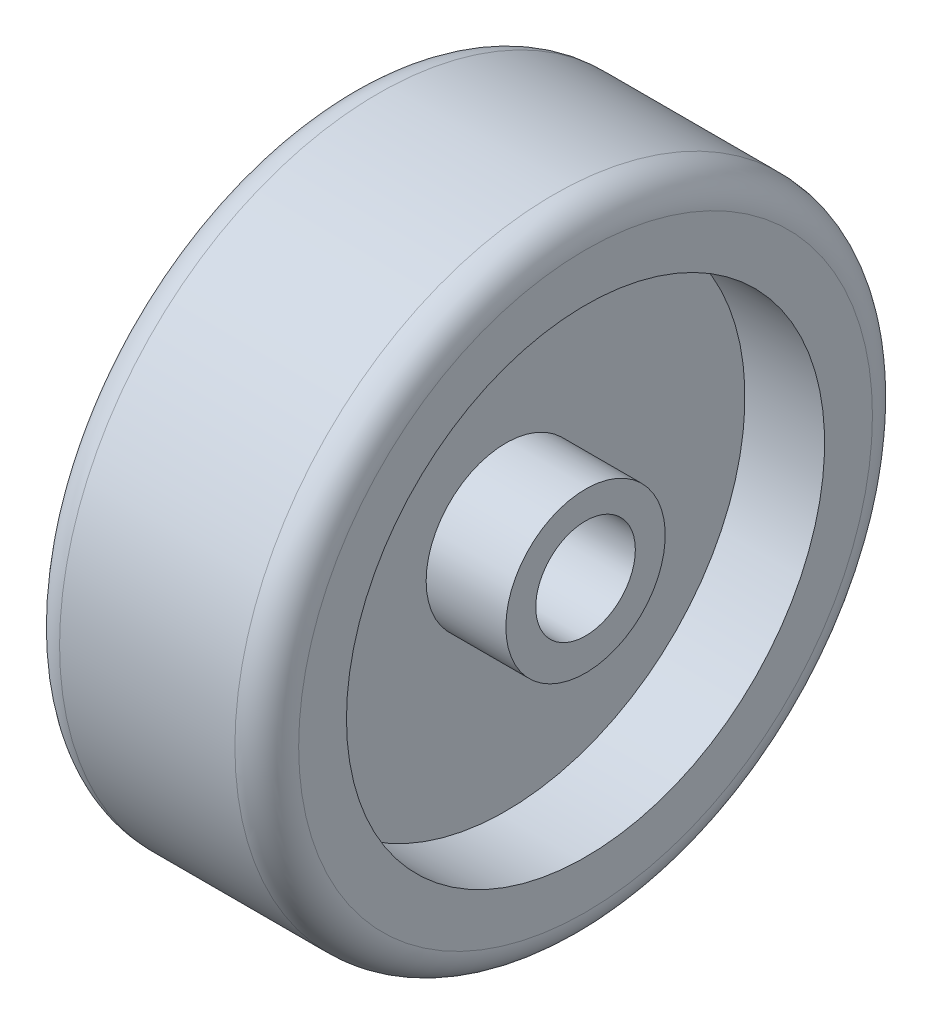
ISO-10303-21;
HEADER;
FILE_DESCRIPTION(('STEP AP214'),'2;1');
FILE_NAME('part.step','',(''),(''),'','','');
FILE_SCHEMA(('AUTOMOTIVE_DESIGN { 1 0 10303 214 1 1 1 1 }'));
ENDSEC;
DATA;
#1=APPLICATION_CONTEXT('core data for automotive mechanical design processes');
#2=APPLICATION_PROTOCOL_DEFINITION('international standard','automotive_design',2000,#1);
#3=PRODUCT_CONTEXT('',#1,'mechanical');
#4=PRODUCT('Part','Part','',(#3));
#5=PRODUCT_RELATED_PRODUCT_CATEGORY('part','',(#4));
#6=PRODUCT_DEFINITION_FORMATION('','',#4);
#7=PRODUCT_DEFINITION_CONTEXT('part definition',#1,'design');
#8=PRODUCT_DEFINITION('design','',#6,#7);
#9=PRODUCT_DEFINITION_SHAPE('','',#8);
#10=(LENGTH_UNIT() NAMED_UNIT(*) SI_UNIT(.MILLI.,.METRE.));
#11=(NAMED_UNIT(*) PLANE_ANGLE_UNIT() SI_UNIT($,.RADIAN.));
#12=(NAMED_UNIT(*) SI_UNIT($,.STERADIAN.) SOLID_ANGLE_UNIT());
#13=UNCERTAINTY_MEASURE_WITH_UNIT(LENGTH_MEASURE(1.E-05),#10,'distance_accuracy_value','');
#14=(GEOMETRIC_REPRESENTATION_CONTEXT(3) GLOBAL_UNCERTAINTY_ASSIGNED_CONTEXT((#13)) GLOBAL_UNIT_ASSIGNED_CONTEXT((#10,
#11,#12)) REPRESENTATION_CONTEXT('',''));
#15=CARTESIAN_POINT('',(0.,0.,0.));
#16=DIRECTION('',(0.,0.,1.));
#17=DIRECTION('',(1.,0.,0.));
#18=AXIS2_PLACEMENT_3D('',#15,#16,#17);
#19=CARTESIAN_POINT('',(38.1,-0.729526652101731,0.));
#20=DIRECTION('',(-1.,0.,0.));
#21=DIRECTION('',(0.,0.,1.));
#22=AXIS2_PLACEMENT_3D('',#19,#20,#21);
#23=PLANE('',#22);
#24=CARTESIAN_POINT('',(38.1,0.,0.));
#25=DIRECTION('',(1.,0.,0.));
#26=DIRECTION('',(0.,0.,-1.));
#27=AXIS2_PLACEMENT_3D('',#24,#25,#26);
#28=CIRCLE('',#27,15.875);
#29=CARTESIAN_POINT('',(38.1,0.,-15.875));
#30=VERTEX_POINT('',#29);
#31=EDGE_CURVE('E113',#30,#30,#28,.T.);
#32=ORIENTED_EDGE('',*,*,#31,.F.);
#33=EDGE_LOOP('',(#32));
#34=FACE_BOUND('',#33,.T.);
#35=CARTESIAN_POINT('',(38.1,-0.729526652101731,0.));
#36=DIRECTION('',(-1.,0.,0.));
#37=DIRECTION('',(0.,0.,1.));
#38=AXIS2_PLACEMENT_3D('',#35,#36,#37);
#39=CIRCLE('',#38,25.4);
#40=CARTESIAN_POINT('',(38.1,-0.729526652101731,25.4));
#41=VERTEX_POINT('',#40);
#42=EDGE_CURVE('E80',#41,#41,#39,.T.);
#43=ORIENTED_EDGE('',*,*,#42,.F.);
#44=EDGE_LOOP('',(#43));
#45=FACE_BOUND('',#44,.T.);
#46=ADVANCED_FACE('F56',(#34,#45),#23,.F.);
#47=CARTESIAN_POINT('',(-38.1,-0.729526652101731,0.));
#48=DIRECTION('',(-1.,0.,0.));
#49=DIRECTION('',(0.,0.,1.));
#50=AXIS2_PLACEMENT_3D('',#47,#48,#49);
#51=CYLINDRICAL_SURFACE('',#50,25.4);
#52=CARTESIAN_POINT('',(12.7,-0.729526652101731,0.));
#53=DIRECTION('',(-1.,0.,0.));
#54=DIRECTION('',(0.,0.,1.));
#55=AXIS2_PLACEMENT_3D('',#52,#53,#54);
#56=CIRCLE('',#55,25.4);
#57=CARTESIAN_POINT('',(12.7,-0.729526652101731,25.4));
#58=VERTEX_POINT('',#57);
#59=EDGE_CURVE('E84',#58,#58,#56,.T.);
#60=ORIENTED_EDGE('',*,*,#59,.F.);
#61=EDGE_LOOP('',(#60));
#62=FACE_BOUND('',#61,.T.);
#63=ORIENTED_EDGE('',*,*,#42,.T.);
#64=EDGE_LOOP('',(#63));
#65=FACE_BOUND('',#64,.T.);
#66=ADVANCED_FACE('F133',(#62,#65),#51,.T.);
#67=CARTESIAN_POINT('',(12.7,24.6704733478983,0.));
#68=DIRECTION('',(-1.,0.,0.));
#69=DIRECTION('',(0.,0.,1.));
#70=AXIS2_PLACEMENT_3D('',#67,#68,#69);
#71=PLANE('',#70);
#72=CARTESIAN_POINT('',(12.7,-0.729526652101731,0.));
#73=DIRECTION('',(-1.,0.,0.));
#74=DIRECTION('',(0.,0.,1.));
#75=AXIS2_PLACEMENT_3D('',#72,#73,#74);
#76=CIRCLE('',#75,76.2);
#77=CARTESIAN_POINT('',(12.7,-0.729526652101731,76.2));
#78=VERTEX_POINT('',#77);
#79=EDGE_CURVE('E88',#78,#78,#76,.T.);
#80=ORIENTED_EDGE('',*,*,#79,.F.);
#81=EDGE_LOOP('',(#80));
#82=FACE_BOUND('',#81,.T.);
#83=ORIENTED_EDGE('',*,*,#59,.T.);
#84=EDGE_LOOP('',(#83));
#85=FACE_BOUND('',#84,.T.);
#86=ADVANCED_FACE('F138',(#82,#85),#71,.F.);
#87=CARTESIAN_POINT('',(-38.1,-0.729526652101731,0.));
#88=DIRECTION('',(-1.,0.,0.));
#89=DIRECTION('',(0.,0.,1.));
#90=AXIS2_PLACEMENT_3D('',#87,#88,#89);
#91=CYLINDRICAL_SURFACE('',#90,76.2);
#92=CARTESIAN_POINT('',(38.1,-0.729526652101731,0.));
#93=DIRECTION('',(-1.,0.,0.));
#94=DIRECTION('',(0.,0.,1.));
#95=AXIS2_PLACEMENT_3D('',#92,#93,#94);
#96=CIRCLE('',#95,76.2);
#97=CARTESIAN_POINT('',(38.1,-0.729526652101731,76.2));
#98=VERTEX_POINT('',#97);
#99=EDGE_CURVE('E92',#98,#98,#96,.T.);
#100=ORIENTED_EDGE('',*,*,#99,.F.);
#101=EDGE_LOOP('',(#100));
#102=FACE_BOUND('',#101,.T.);
#103=ORIENTED_EDGE('',*,*,#79,.T.);
#104=EDGE_LOOP('',(#103));
#105=FACE_BOUND('',#104,.T.);
#106=ADVANCED_FACE('F144',(#102,#105),#91,.F.);
#107=CARTESIAN_POINT('',(38.1,75.4704733478983,0.));
#108=DIRECTION('',(-1.,0.,0.));
#109=DIRECTION('',(0.,0.,1.));
#110=AXIS2_PLACEMENT_3D('',#107,#108,#109);
#111=PLANE('',#110);
#112=CARTESIAN_POINT('',(38.1,-0.729526652101731,0.));
#113=DIRECTION('',(-1.,0.,0.));
#114=DIRECTION('',(0.,0.,1.));
#115=AXIS2_PLACEMENT_3D('',#112,#113,#114);
#116=CIRCLE('',#115,91.44);
#117=CARTESIAN_POINT('',(38.1,-0.729526652101731,91.44));
#118=VERTEX_POINT('',#117);
#119=EDGE_CURVE('E69',#118,#118,#116,.F.);
#120=ORIENTED_EDGE('',*,*,#119,.T.);
#121=EDGE_LOOP('',(#120));
#122=FACE_BOUND('',#121,.T.);
#123=ORIENTED_EDGE('',*,*,#99,.T.);
#124=EDGE_LOOP('',(#123));
#125=FACE_BOUND('',#124,.T.);
#126=ADVANCED_FACE('F162',(#122,#125),#111,.F.);
#127=CARTESIAN_POINT('',(-38.1,-0.729526652101731,0.));
#128=DIRECTION('',(-1.,0.,0.));
#129=DIRECTION('',(0.,0.,1.));
#130=AXIS2_PLACEMENT_3D('',#127,#128,#129);
#131=CYLINDRICAL_SURFACE('',#130,101.6);
#132=CARTESIAN_POINT('',(-27.94,-0.729526652101731,0.));
#133=DIRECTION('',(1.,0.,0.));
#134=DIRECTION('',(0.,0.,-1.));
#135=AXIS2_PLACEMENT_3D('',#132,#133,#134);
#136=CIRCLE('',#135,101.6);
#137=CARTESIAN_POINT('',(-27.94,-0.729526652101731,-101.6));
#138=VERTEX_POINT('',#137);
#139=EDGE_CURVE('E11',#138,#138,#136,.T.);
#140=ORIENTED_EDGE('',*,*,#139,.T.);
#141=EDGE_LOOP('',(#140));
#142=FACE_BOUND('',#141,.T.);
#143=CARTESIAN_POINT('',(27.94,-0.729526652101731,0.));
#144=DIRECTION('',(-1.,0.,0.));
#145=DIRECTION('',(0.,0.,1.));
#146=AXIS2_PLACEMENT_3D('',#143,#144,#145);
#147=CIRCLE('',#146,101.6);
#148=CARTESIAN_POINT('',(27.94,-0.729526652101731,101.6));
#149=VERTEX_POINT('',#148);
#150=EDGE_CURVE('E74',#149,#149,#147,.T.);
#151=ORIENTED_EDGE('',*,*,#150,.T.);
#152=EDGE_LOOP('',(#151));
#153=FACE_BOUND('',#152,.T.);
#154=ADVANCED_FACE('F159',(#142,#153),#131,.T.);
#155=CARTESIAN_POINT('',(-38.1,75.4704733478983,0.));
#156=DIRECTION('',(1.,0.,0.));
#157=DIRECTION('',(0.,0.,-1.));
#158=AXIS2_PLACEMENT_3D('',#155,#156,#157);
#159=PLANE('',#158);
#160=CARTESIAN_POINT('',(-38.1,-0.729526652101731,0.));
#161=DIRECTION('',(1.,0.,0.));
#162=DIRECTION('',(0.,0.,-1.));
#163=AXIS2_PLACEMENT_3D('',#160,#161,#162);
#164=CIRCLE('',#163,91.44);
#165=CARTESIAN_POINT('',(-38.1,-0.729526652101731,-91.44));
#166=VERTEX_POINT('',#165);
#167=EDGE_CURVE('E64',#166,#166,#164,.F.);
#168=ORIENTED_EDGE('',*,*,#167,.T.);
#169=EDGE_LOOP('',(#168));
#170=FACE_BOUND('',#169,.T.);
#171=CARTESIAN_POINT('',(-38.1,-0.729526652101731,0.));
#172=DIRECTION('',(-1.,0.,0.));
#173=DIRECTION('',(0.,0.,1.));
#174=AXIS2_PLACEMENT_3D('',#171,#172,#173);
#175=CIRCLE('',#174,76.2);
#176=CARTESIAN_POINT('',(-38.1,-0.729526652101731,76.2));
#177=VERTEX_POINT('',#176);
#178=EDGE_CURVE('E96',#177,#177,#175,.T.);
#179=ORIENTED_EDGE('',*,*,#178,.F.);
#180=EDGE_LOOP('',(#179));
#181=FACE_BOUND('',#180,.T.);
#182=ADVANCED_FACE('F161',(#170,#181),#159,.F.);
#183=CARTESIAN_POINT('',(-38.1,-0.729526652101731,0.));
#184=DIRECTION('',(-1.,0.,0.));
#185=DIRECTION('',(0.,0.,1.));
#186=AXIS2_PLACEMENT_3D('',#183,#184,#185);
#187=CYLINDRICAL_SURFACE('',#186,76.2);
#188=CARTESIAN_POINT('',(-12.7,-0.729526652101731,0.));
#189=DIRECTION('',(-1.,0.,0.));
#190=DIRECTION('',(0.,0.,1.));
#191=AXIS2_PLACEMENT_3D('',#188,#189,#190);
#192=CIRCLE('',#191,76.2);
#193=CARTESIAN_POINT('',(-12.7,-0.729526652101731,76.2));
#194=VERTEX_POINT('',#193);
#195=EDGE_CURVE('E100',#194,#194,#192,.T.);
#196=ORIENTED_EDGE('',*,*,#195,.F.);
#197=EDGE_LOOP('',(#196));
#198=FACE_BOUND('',#197,.T.);
#199=ORIENTED_EDGE('',*,*,#178,.T.);
#200=EDGE_LOOP('',(#199));
#201=FACE_BOUND('',#200,.T.);
#202=ADVANCED_FACE('F168',(#198,#201),#187,.F.);
#203=CARTESIAN_POINT('',(-12.7,24.6704733478983,0.));
#204=DIRECTION('',(1.,0.,0.));
#205=DIRECTION('',(0.,0.,-1.));
#206=AXIS2_PLACEMENT_3D('',#203,#204,#205);
#207=PLANE('',#206);
#208=CARTESIAN_POINT('',(-12.7,-0.729526652101731,0.));
#209=DIRECTION('',(-1.,0.,0.));
#210=DIRECTION('',(0.,0.,1.));
#211=AXIS2_PLACEMENT_3D('',#208,#209,#210);
#212=CIRCLE('',#211,25.4);
#213=CARTESIAN_POINT('',(-12.7,-0.729526652101731,25.4));
#214=VERTEX_POINT('',#213);
#215=EDGE_CURVE('E104',#214,#214,#212,.T.);
#216=ORIENTED_EDGE('',*,*,#215,.F.);
#217=EDGE_LOOP('',(#216));
#218=FACE_BOUND('',#217,.T.);
#219=ORIENTED_EDGE('',*,*,#195,.T.);
#220=EDGE_LOOP('',(#219));
#221=FACE_BOUND('',#220,.T.);
#222=ADVANCED_FACE('F221',(#218,#221),#207,.F.);
#223=CARTESIAN_POINT('',(-38.1,-0.729526652101731,0.));
#224=DIRECTION('',(-1.,0.,0.));
#225=DIRECTION('',(0.,0.,1.));
#226=AXIS2_PLACEMENT_3D('',#223,#224,#225);
#227=CYLINDRICAL_SURFACE('',#226,25.4);
#228=CARTESIAN_POINT('',(-38.1,-0.729526652101731,0.));
#229=DIRECTION('',(-1.,0.,0.));
#230=DIRECTION('',(0.,0.,1.));
#231=AXIS2_PLACEMENT_3D('',#228,#229,#230);
#232=CIRCLE('',#231,25.4);
#233=CARTESIAN_POINT('',(-38.1,-0.729526652101731,25.4));
#234=VERTEX_POINT('',#233);
#235=EDGE_CURVE('E108',#234,#234,#232,.T.);
#236=ORIENTED_EDGE('',*,*,#235,.F.);
#237=EDGE_LOOP('',(#236));
#238=FACE_BOUND('',#237,.T.);
#239=ORIENTED_EDGE('',*,*,#215,.T.);
#240=EDGE_LOOP('',(#239));
#241=FACE_BOUND('',#240,.T.);
#242=ADVANCED_FACE('F227',(#238,#241),#227,.T.);
#243=CARTESIAN_POINT('',(-38.1,-0.729526652101731,0.));
#244=DIRECTION('',(1.,0.,0.));
#245=DIRECTION('',(0.,0.,-1.));
#246=AXIS2_PLACEMENT_3D('',#243,#244,#245);
#247=PLANE('',#246);
#248=CARTESIAN_POINT('',(-38.1,0.,0.));
#249=DIRECTION('',(1.,0.,0.));
#250=DIRECTION('',(0.,0.,-1.));
#251=AXIS2_PLACEMENT_3D('',#248,#249,#250);
#252=CIRCLE('',#251,15.875);
#253=CARTESIAN_POINT('',(-38.1,0.,-15.875));
#254=VERTEX_POINT('',#253);
#255=EDGE_CURVE('E112',#254,#254,#252,.T.);
#256=ORIENTED_EDGE('',*,*,#255,.T.);
#257=EDGE_LOOP('',(#256));
#258=FACE_BOUND('',#257,.T.);
#259=ORIENTED_EDGE('',*,*,#235,.T.);
#260=EDGE_LOOP('',(#259));
#261=FACE_BOUND('',#260,.T.);
#262=ADVANCED_FACE('F121',(#258,#261),#247,.F.);
#263=CARTESIAN_POINT('',(-38.1,0.,0.));
#264=DIRECTION('',(1.,0.,0.));
#265=DIRECTION('',(0.,0.,-1.));
#266=AXIS2_PLACEMENT_3D('',#263,#264,#265);
#267=CYLINDRICAL_SURFACE('',#266,15.875);
#268=CARTESIAN_POINT('',(-38.1,0.,-15.875));
#269=CARTESIAN_POINT('',(-37.30625,0.,-15.875));
#270=CARTESIAN_POINT('',(-36.5125,0.,-15.875));
#271=CARTESIAN_POINT('',(-34.925,0.,-15.875));
#272=CARTESIAN_POINT('',(-34.13125,0.,-15.875));
#273=CARTESIAN_POINT('',(-32.54375,0.,-15.875));
#274=CARTESIAN_POINT('',(-31.75,0.,-15.875));
#275=CARTESIAN_POINT('',(-30.1625,0.,-15.875));
#276=CARTESIAN_POINT('',(-29.36875,0.,-15.875));
#277=CARTESIAN_POINT('',(-27.78125,0.,-15.875));
#278=CARTESIAN_POINT('',(-26.9875,0.,-15.875));
#279=CARTESIAN_POINT('',(-25.4,0.,-15.875));
#280=CARTESIAN_POINT('',(-24.60625,0.,-15.875));
#281=CARTESIAN_POINT('',(-23.01875,0.,-15.875));
#282=CARTESIAN_POINT('',(-22.225,0.,-15.875));
#283=CARTESIAN_POINT('',(-20.6375,0.,-15.875));
#284=CARTESIAN_POINT('',(-19.84375,0.,-15.875));
#285=CARTESIAN_POINT('',(-18.25625,0.,-15.875));
#286=CARTESIAN_POINT('',(-17.4625,0.,-15.875));
#287=CARTESIAN_POINT('',(-15.875,0.,-15.875));
#288=CARTESIAN_POINT('',(-15.08125,0.,-15.875));
#289=CARTESIAN_POINT('',(-13.49375,0.,-15.875));
#290=CARTESIAN_POINT('',(-12.7,0.,-15.875));
#291=CARTESIAN_POINT('',(-11.1125,0.,-15.875));
#292=CARTESIAN_POINT('',(-10.31875,0.,-15.875));
#293=CARTESIAN_POINT('',(-8.73125,0.,-15.875));
#294=CARTESIAN_POINT('',(-7.9375,0.,-15.875));
#295=CARTESIAN_POINT('',(-6.35,0.,-15.875));
#296=CARTESIAN_POINT('',(-5.55625,0.,-15.875));
#297=CARTESIAN_POINT('',(-3.96875,0.,-15.875));
#298=CARTESIAN_POINT('',(-3.175,0.,-15.875));
#299=CARTESIAN_POINT('',(-1.5875,0.,-15.875));
#300=CARTESIAN_POINT('',(-0.793750000000001,0.,-15.875));
#301=CARTESIAN_POINT('',(0.793750000000001,0.,-15.875));
#302=CARTESIAN_POINT('',(1.5875,0.,-15.875));
#303=CARTESIAN_POINT('',(3.175,0.,-15.875));
#304=CARTESIAN_POINT('',(3.96875,0.,-15.875));
#305=CARTESIAN_POINT('',(5.55625,0.,-15.875));
#306=CARTESIAN_POINT('',(6.35,0.,-15.875));
#307=CARTESIAN_POINT('',(7.93750000000001,0.,-15.875));
#308=CARTESIAN_POINT('',(8.73125,0.,-15.875));
#309=CARTESIAN_POINT('',(10.31875,0.,-15.875));
#310=CARTESIAN_POINT('',(11.1125,0.,-15.875));
#311=CARTESIAN_POINT('',(12.7,0.,-15.875));
#312=CARTESIAN_POINT('',(13.49375,0.,-15.875));
#313=CARTESIAN_POINT('',(15.08125,0.,-15.875));
#314=CARTESIAN_POINT('',(15.875,0.,-15.875));
#315=CARTESIAN_POINT('',(17.4625,0.,-15.875));
#316=CARTESIAN_POINT('',(18.25625,0.,-15.875));
#317=CARTESIAN_POINT('',(19.84375,0.,-15.875));
#318=CARTESIAN_POINT('',(20.6375,0.,-15.875));
#319=CARTESIAN_POINT('',(22.225,0.,-15.875));
#320=CARTESIAN_POINT('',(23.01875,0.,-15.875));
#321=CARTESIAN_POINT('',(24.60625,0.,-15.875));
#322=CARTESIAN_POINT('',(25.4,0.,-15.875));
#323=CARTESIAN_POINT('',(26.9875,0.,-15.875));
#324=CARTESIAN_POINT('',(27.78125,0.,-15.875));
#325=CARTESIAN_POINT('',(29.36875,0.,-15.875));
#326=CARTESIAN_POINT('',(30.1625,0.,-15.875));
#327=CARTESIAN_POINT('',(31.75,0.,-15.875));
#328=CARTESIAN_POINT('',(32.54375,0.,-15.875));
#329=CARTESIAN_POINT('',(34.13125,0.,-15.875));
#330=CARTESIAN_POINT('',(34.925,0.,-15.875));
#331=CARTESIAN_POINT('',(36.5125,0.,-15.875));
#332=CARTESIAN_POINT('',(37.30625,0.,-15.875));
#333=CARTESIAN_POINT('',(38.1,0.,-15.875));
#334=B_SPLINE_CURVE_WITH_KNOTS('',3,(#268,#269,#270,#271,#272,#273,#274,#275,#276,#277,#278,
#279,#280,#281,#282,#283,#284,#285,#286,#287,#288,#289,#290,#291,#292,#293,#294,#295,#296,#297,
#298,#299,#300,#301,#302,#303,#304,#305,#306,#307,#308,#309,#310,#311,#312,#313,#314,#315,#316,
#317,#318,#319,#320,#321,#322,#323,#324,#325,#326,#327,#328,#329,#330,#331,#332,#333),
.UNSPECIFIED.,.F.,.F.,(4,2,2,2,2,2,2,2,2,2,2,2,2,2,2,2,2,2,2,2,2,2,2,2,2,2,2,2,2,2,2,2,4),(0.,
2.38124999999999,4.7625,7.14375,9.525,11.90625,14.2875,16.66875,19.05,21.43125,23.8125,26.19375,
28.575,30.95625,33.3375,35.71875,38.1,40.48125,42.8625,45.24375,47.625,50.00625,52.3875,
54.76875,57.15,59.53125,61.9125,64.29375,66.675,69.05625,71.4375,73.81875,76.2),.UNSPECIFIED.);
#335=EDGE_CURVE('BSEAM124',#254,#30,#334,.T.);
#336=ORIENTED_EDGE('',*,*,#255,.F.);
#337=ORIENTED_EDGE('',*,*,#31,.T.);
#338=ORIENTED_EDGE('',*,*,#335,.T.);
#339=ORIENTED_EDGE('',*,*,#335,.F.);
#340=EDGE_LOOP('',(#336,#338,#337,#339));
#341=FACE_BOUND('',#340,.T.);
#342=ADVANCED_FACE('F124',(#341),#267,.F.);
#343=CARTESIAN_POINT('',(27.94,-0.729526652101731,0.));
#344=DIRECTION('',(-1.,0.,0.));
#345=DIRECTION('',(0.,0.,1.));
#346=AXIS2_PLACEMENT_3D('',#343,#344,#345);
#347=TOROIDAL_SURFACE('',#346,91.44,10.16);
#348=ORIENTED_EDGE('',*,*,#119,.F.);
#349=EDGE_LOOP('',(#348));
#350=FACE_BOUND('',#349,.T.);
#351=ORIENTED_EDGE('',*,*,#150,.F.);
#352=EDGE_LOOP('',(#351));
#353=FACE_BOUND('',#352,.T.);
#354=ADVANCED_FACE('F127',(#350,#353),#347,.T.);
#355=CARTESIAN_POINT('',(-27.94,-0.729526652101731,0.));
#356=DIRECTION('',(1.,0.,0.));
#357=DIRECTION('',(0.,0.,-1.));
#358=AXIS2_PLACEMENT_3D('',#355,#356,#357);
#359=TOROIDAL_SURFACE('',#358,91.44,10.16);
#360=ORIENTED_EDGE('',*,*,#139,.F.);
#361=EDGE_LOOP('',(#360));
#362=FACE_BOUND('',#361,.T.);
#363=ORIENTED_EDGE('',*,*,#167,.F.);
#364=EDGE_LOOP('',(#363));
#365=FACE_BOUND('',#364,.T.);
#366=ADVANCED_FACE('F58',(#362,#365),#359,.T.);
#367=CLOSED_SHELL('',(#46,#66,#86,#106,#126,#154,#182,#202,#222,#242,#262,#342,#354,#366));
#368=MANIFOLD_SOLID_BREP('B2',#367);
#369=ADVANCED_BREP_SHAPE_REPRESENTATION('',(#18,#368),#14);
#370=SHAPE_DEFINITION_REPRESENTATION(#9,#369);
ENDSEC;
END-ISO-10303-21;
